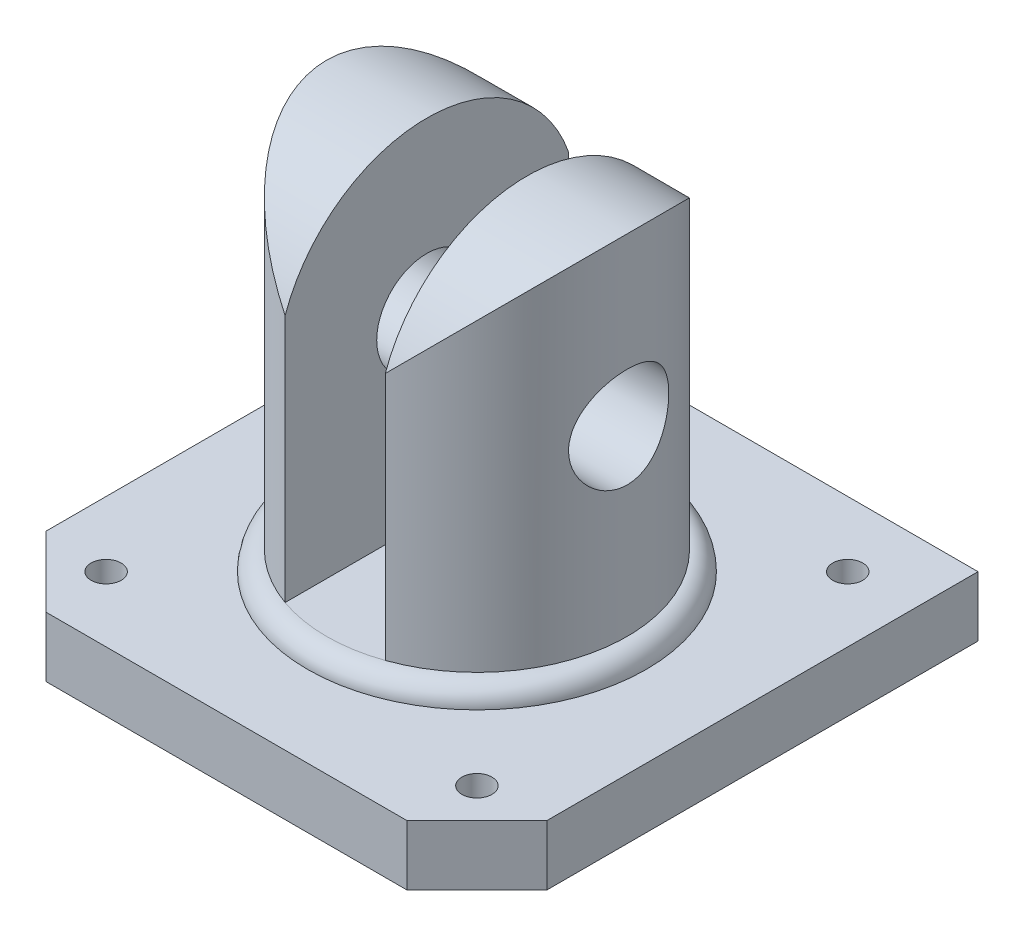
ISO-10303-21;
HEADER;
FILE_DESCRIPTION(('STEP AP214'),'2;1');
FILE_NAME('part.step','',(''),(''),'','','');
FILE_SCHEMA(('AUTOMOTIVE_DESIGN { 1 0 10303 214 1 1 1 1 }'));
ENDSEC;
DATA;
#1=APPLICATION_CONTEXT('core data for automotive mechanical design processes');
#2=APPLICATION_PROTOCOL_DEFINITION('international standard','automotive_design',2000,#1);
#3=PRODUCT_CONTEXT('',#1,'mechanical');
#4=PRODUCT('Part','Part','',(#3));
#5=PRODUCT_RELATED_PRODUCT_CATEGORY('part','',(#4));
#6=PRODUCT_DEFINITION_FORMATION('','',#4);
#7=PRODUCT_DEFINITION_CONTEXT('part definition',#1,'design');
#8=PRODUCT_DEFINITION('design','',#6,#7);
#9=PRODUCT_DEFINITION_SHAPE('','',#8);
#10=(LENGTH_UNIT() NAMED_UNIT(*) SI_UNIT(.MILLI.,.METRE.));
#11=(NAMED_UNIT(*) PLANE_ANGLE_UNIT() SI_UNIT($,.RADIAN.));
#12=(NAMED_UNIT(*) SI_UNIT($,.STERADIAN.) SOLID_ANGLE_UNIT());
#13=UNCERTAINTY_MEASURE_WITH_UNIT(LENGTH_MEASURE(1.E-05),#10,'distance_accuracy_value','');
#14=(GEOMETRIC_REPRESENTATION_CONTEXT(3) GLOBAL_UNCERTAINTY_ASSIGNED_CONTEXT((#13)) GLOBAL_UNIT_ASSIGNED_CONTEXT((#10,
#11,#12)) REPRESENTATION_CONTEXT('',''));
#15=CARTESIAN_POINT('',(0.,0.,0.));
#16=DIRECTION('',(0.,0.,1.));
#17=DIRECTION('',(1.,0.,0.));
#18=AXIS2_PLACEMENT_3D('',#15,#16,#17);
#19=CARTESIAN_POINT('',(25.,6.,-25.));
#20=DIRECTION('',(-1.,0.,0.));
#21=DIRECTION('',(0.,0.,1.));
#22=AXIS2_PLACEMENT_3D('',#19,#20,#21);
#23=PLANE('',#22);
#24=DIRECTION('',(0.,0.,-1.));
#25=VECTOR('',#24,1.);
#26=CARTESIAN_POINT('',(25.,6.,-25.));
#27=LINE('',#26,#25);
#28=CARTESIAN_POINT('',(25.,6.,18.));
#29=VERTEX_POINT('',#28);
#30=CARTESIAN_POINT('',(25.,6.,-25.));
#31=VERTEX_POINT('',#30);
#32=EDGE_CURVE('E170',#29,#31,#27,.T.);
#33=ORIENTED_EDGE('',*,*,#32,.F.);
#34=DIRECTION('',(0.,-1.,0.));
#35=VECTOR('',#34,1.);
#36=CARTESIAN_POINT('',(25.,6.,18.));
#37=LINE('',#36,#35);
#38=CARTESIAN_POINT('',(25.,0.,18.));
#39=VERTEX_POINT('',#38);
#40=EDGE_CURVE('E191',#29,#39,#37,.T.);
#41=ORIENTED_EDGE('',*,*,#40,.T.);
#42=DIRECTION('',(0.,0.,-1.));
#43=VECTOR('',#42,1.);
#44=CARTESIAN_POINT('',(25.,0.,-25.));
#45=LINE('',#44,#43);
#46=CARTESIAN_POINT('',(25.,0.,-25.));
#47=VERTEX_POINT('',#46);
#48=EDGE_CURVE('E169',#39,#47,#45,.T.);
#49=ORIENTED_EDGE('',*,*,#48,.T.);
#50=DIRECTION('',(0.,-1.,0.));
#51=VECTOR('',#50,1.);
#52=CARTESIAN_POINT('',(25.,6.,-25.));
#53=LINE('',#52,#51);
#54=EDGE_CURVE('E188',#31,#47,#53,.T.);
#55=ORIENTED_EDGE('',*,*,#54,.F.);
#56=EDGE_LOOP('',(#33,#41,#49,#55));
#57=FACE_BOUND('',#56,.T.);
#58=ADVANCED_FACE('F44',(#57),#23,.F.);
#59=CARTESIAN_POINT('',(-25.,6.,-25.));
#60=DIRECTION('',(0.,0.,1.));
#61=DIRECTION('',(1.,0.,0.));
#62=AXIS2_PLACEMENT_3D('',#59,#60,#61);
#63=PLANE('',#62);
#64=DIRECTION('',(-1.,0.,0.));
#65=VECTOR('',#64,1.);
#66=CARTESIAN_POINT('',(-25.,0.,-25.));
#67=LINE('',#66,#65);
#68=CARTESIAN_POINT('',(-25.,0.,-25.));
#69=VERTEX_POINT('',#68);
#70=EDGE_CURVE('E181',#47,#69,#67,.T.);
#71=ORIENTED_EDGE('',*,*,#70,.T.);
#72=DIRECTION('',(0.,-1.,0.));
#73=VECTOR('',#72,1.);
#74=CARTESIAN_POINT('',(-25.,6.,-25.));
#75=LINE('',#74,#73);
#76=CARTESIAN_POINT('',(-25.,6.,-25.));
#77=VERTEX_POINT('',#76);
#78=EDGE_CURVE('E179',#77,#69,#75,.T.);
#79=ORIENTED_EDGE('',*,*,#78,.F.);
#80=DIRECTION('',(-1.,0.,0.));
#81=VECTOR('',#80,1.);
#82=CARTESIAN_POINT('',(-25.,6.,-25.));
#83=LINE('',#82,#81);
#84=EDGE_CURVE('E172',#31,#77,#83,.T.);
#85=ORIENTED_EDGE('',*,*,#84,.F.);
#86=ORIENTED_EDGE('',*,*,#54,.T.);
#87=EDGE_LOOP('',(#71,#79,#85,#86));
#88=FACE_BOUND('',#87,.T.);
#89=ADVANCED_FACE('F246',(#88),#63,.F.);
#90=CARTESIAN_POINT('',(-25.,6.,-25.));
#91=DIRECTION('',(1.,0.,0.));
#92=DIRECTION('',(0.,0.,-1.));
#93=AXIS2_PLACEMENT_3D('',#90,#91,#92);
#94=PLANE('',#93);
#95=DIRECTION('',(0.,0.,1.));
#96=VECTOR('',#95,1.);
#97=CARTESIAN_POINT('',(-25.,0.,-25.));
#98=LINE('',#97,#96);
#99=CARTESIAN_POINT('',(-25.,0.,18.));
#100=VERTEX_POINT('',#99);
#101=EDGE_CURVE('E183',#69,#100,#98,.T.);
#102=ORIENTED_EDGE('',*,*,#101,.T.);
#103=DIRECTION('',(0.,1.,0.));
#104=VECTOR('',#103,1.);
#105=CARTESIAN_POINT('',(-25.,6.,18.));
#106=LINE('',#105,#104);
#107=CARTESIAN_POINT('',(-25.,6.,18.));
#108=VERTEX_POINT('',#107);
#109=EDGE_CURVE('E53',#100,#108,#106,.T.);
#110=ORIENTED_EDGE('',*,*,#109,.T.);
#111=DIRECTION('',(0.,0.,1.));
#112=VECTOR('',#111,1.);
#113=CARTESIAN_POINT('',(-25.,6.,-25.));
#114=LINE('',#113,#112);
#115=EDGE_CURVE('E175',#77,#108,#114,.T.);
#116=ORIENTED_EDGE('',*,*,#115,.F.);
#117=ORIENTED_EDGE('',*,*,#78,.T.);
#118=EDGE_LOOP('',(#102,#110,#116,#117));
#119=FACE_BOUND('',#118,.T.);
#120=ADVANCED_FACE('F261',(#119),#94,.F.);
#121=CARTESIAN_POINT('',(-25.,6.,25.));
#122=DIRECTION('',(0.,0.,-1.));
#123=DIRECTION('',(-1.,0.,0.));
#124=AXIS2_PLACEMENT_3D('',#121,#122,#123);
#125=PLANE('',#124);
#126=DIRECTION('',(1.,0.,0.));
#127=VECTOR('',#126,1.);
#128=CARTESIAN_POINT('',(-25.,6.,25.));
#129=LINE('',#128,#127);
#130=CARTESIAN_POINT('',(-18.,6.,25.));
#131=VERTEX_POINT('',#130);
#132=CARTESIAN_POINT('',(18.,6.,25.));
#133=VERTEX_POINT('',#132);
#134=EDGE_CURVE('E177',#131,#133,#129,.T.);
#135=ORIENTED_EDGE('',*,*,#134,.F.);
#136=DIRECTION('',(0.,-1.,0.));
#137=VECTOR('',#136,1.);
#138=CARTESIAN_POINT('',(-18.,6.,25.));
#139=LINE('',#138,#137);
#140=CARTESIAN_POINT('',(-18.,0.,25.));
#141=VERTEX_POINT('',#140);
#142=EDGE_CURVE('E209',#131,#141,#139,.T.);
#143=ORIENTED_EDGE('',*,*,#142,.T.);
#144=DIRECTION('',(1.,0.,0.));
#145=VECTOR('',#144,1.);
#146=CARTESIAN_POINT('',(-25.,0.,25.));
#147=LINE('',#146,#145);
#148=CARTESIAN_POINT('',(18.,0.,25.));
#149=VERTEX_POINT('',#148);
#150=EDGE_CURVE('E173',#141,#149,#147,.T.);
#151=ORIENTED_EDGE('',*,*,#150,.T.);
#152=DIRECTION('',(0.,1.,0.));
#153=VECTOR('',#152,1.);
#154=CARTESIAN_POINT('',(18.,6.,25.));
#155=LINE('',#154,#153);
#156=EDGE_CURVE('E197',#149,#133,#155,.T.);
#157=ORIENTED_EDGE('',*,*,#156,.T.);
#158=EDGE_LOOP('',(#135,#143,#151,#157));
#159=FACE_BOUND('',#158,.T.);
#160=ADVANCED_FACE('F228',(#159),#125,.F.);
#161=CARTESIAN_POINT('',(0.,6.,0.));
#162=DIRECTION('',(0.,1.,0.));
#163=DIRECTION('',(0.,0.,1.));
#164=AXIS2_PLACEMENT_3D('',#161,#162,#163);
#165=PLANE('',#164);
#166=CARTESIAN_POINT('',(-18.5,6.,18.5));
#167=DIRECTION('',(0.,1.,0.));
#168=DIRECTION('',(0.,0.,1.));
#169=AXIS2_PLACEMENT_3D('',#166,#167,#168);
#170=CIRCLE('',#169,1.5);
#171=CARTESIAN_POINT('',(-18.5,6.,20.));
#172=VERTEX_POINT('',#171);
#173=EDGE_CURVE('E505',#172,#172,#170,.T.);
#174=ORIENTED_EDGE('',*,*,#173,.F.);
#175=EDGE_LOOP('',(#174));
#176=FACE_BOUND('',#175,.T.);
#177=CARTESIAN_POINT('',(18.5,6.,18.5));
#178=DIRECTION('',(0.,1.,0.));
#179=DIRECTION('',(0.,0.,1.));
#180=AXIS2_PLACEMENT_3D('',#177,#178,#179);
#181=CIRCLE('',#180,1.5);
#182=CARTESIAN_POINT('',(18.5,6.,20.));
#183=VERTEX_POINT('',#182);
#184=EDGE_CURVE('E508',#183,#183,#181,.T.);
#185=ORIENTED_EDGE('',*,*,#184,.F.);
#186=EDGE_LOOP('',(#185));
#187=FACE_BOUND('',#186,.T.);
#188=CARTESIAN_POINT('',(18.5,6.,-18.5));
#189=DIRECTION('',(0.,1.,0.));
#190=DIRECTION('',(0.,0.,1.));
#191=AXIS2_PLACEMENT_3D('',#188,#189,#190);
#192=CIRCLE('',#191,1.5);
#193=CARTESIAN_POINT('',(18.5,6.,-17.));
#194=VERTEX_POINT('',#193);
#195=EDGE_CURVE('E504',#194,#194,#192,.T.);
#196=ORIENTED_EDGE('',*,*,#195,.F.);
#197=EDGE_LOOP('',(#196));
#198=FACE_BOUND('',#197,.T.);
#199=CARTESIAN_POINT('',(-18.5,6.,-18.5));
#200=DIRECTION('',(0.,1.,0.));
#201=DIRECTION('',(0.,0.,1.));
#202=AXIS2_PLACEMENT_3D('',#199,#200,#201);
#203=CIRCLE('',#202,1.5);
#204=CARTESIAN_POINT('',(-18.5,6.,-17.));
#205=VERTEX_POINT('',#204);
#206=EDGE_CURVE('E214',#205,#205,#203,.T.);
#207=ORIENTED_EDGE('',*,*,#206,.F.);
#208=EDGE_LOOP('',(#207));
#209=FACE_BOUND('',#208,.T.);
#210=CARTESIAN_POINT('',(0.,6.,0.));
#211=DIRECTION('',(0.,1.,0.));
#212=DIRECTION('',(0.,0.,1.));
#213=AXIS2_PLACEMENT_3D('',#210,#211,#212);
#214=CIRCLE('',#213,16.9);
#215=CARTESIAN_POINT('',(0.,6.,16.9));
#216=VERTEX_POINT('',#215);
#217=EDGE_CURVE('E203',#216,#216,#214,.T.);
#218=ORIENTED_EDGE('',*,*,#217,.F.);
#219=EDGE_LOOP('',(#218));
#220=FACE_BOUND('',#219,.T.);
#221=ORIENTED_EDGE('',*,*,#115,.T.);
#222=DIRECTION('',(-0.707106781186546,0.,-0.707106781186549));
#223=VECTOR('',#222,1.);
#224=CARTESIAN_POINT('',(-21.5,6.,21.5));
#225=LINE('',#224,#223);
#226=EDGE_CURVE('E11',#108,#131,#225,.F.);
#227=ORIENTED_EDGE('',*,*,#226,.T.);
#228=ORIENTED_EDGE('',*,*,#134,.T.);
#229=DIRECTION('',(-0.707106781186549,0.,0.707106781186546));
#230=VECTOR('',#229,1.);
#231=CARTESIAN_POINT('',(21.5,6.,21.5000000000001));
#232=LINE('',#231,#230);
#233=EDGE_CURVE('E200',#133,#29,#232,.F.);
#234=ORIENTED_EDGE('',*,*,#233,.T.);
#235=ORIENTED_EDGE('',*,*,#32,.T.);
#236=ORIENTED_EDGE('',*,*,#84,.T.);
#237=EDGE_LOOP('',(#221,#227,#228,#234,#235,#236));
#238=FACE_BOUND('',#237,.T.);
#239=ADVANCED_FACE('F241',(#176,#187,#198,#209,#220,#238),#165,.T.);
#240=CARTESIAN_POINT('',(0.,0.,0.));
#241=DIRECTION('',(0.,1.,0.));
#242=DIRECTION('',(0.,0.,1.));
#243=AXIS2_PLACEMENT_3D('',#240,#241,#242);
#244=PLANE('',#243);
#245=CARTESIAN_POINT('',(-18.5,0.,18.5));
#246=DIRECTION('',(0.,1.,0.));
#247=DIRECTION('',(0.,0.,1.));
#248=AXIS2_PLACEMENT_3D('',#245,#246,#247);
#249=CIRCLE('',#248,1.5);
#250=CARTESIAN_POINT('',(-18.5,0.,20.));
#251=VERTEX_POINT('',#250);
#252=EDGE_CURVE('E220',#251,#251,#249,.T.);
#253=ORIENTED_EDGE('',*,*,#252,.T.);
#254=EDGE_LOOP('',(#253));
#255=FACE_BOUND('',#254,.T.);
#256=CARTESIAN_POINT('',(18.5,0.,18.5));
#257=DIRECTION('',(0.,1.,0.));
#258=DIRECTION('',(0.,0.,1.));
#259=AXIS2_PLACEMENT_3D('',#256,#257,#258);
#260=CIRCLE('',#259,1.5);
#261=CARTESIAN_POINT('',(18.5,0.,20.));
#262=VERTEX_POINT('',#261);
#263=EDGE_CURVE('E217',#262,#262,#260,.T.);
#264=ORIENTED_EDGE('',*,*,#263,.T.);
#265=EDGE_LOOP('',(#264));
#266=FACE_BOUND('',#265,.T.);
#267=CARTESIAN_POINT('',(18.5,0.,-18.5));
#268=DIRECTION('',(0.,1.,0.));
#269=DIRECTION('',(0.,0.,1.));
#270=AXIS2_PLACEMENT_3D('',#267,#268,#269);
#271=CIRCLE('',#270,1.5);
#272=CARTESIAN_POINT('',(18.5,0.,-17.));
#273=VERTEX_POINT('',#272);
#274=EDGE_CURVE('E213',#273,#273,#271,.T.);
#275=ORIENTED_EDGE('',*,*,#274,.T.);
#276=EDGE_LOOP('',(#275));
#277=FACE_BOUND('',#276,.T.);
#278=CARTESIAN_POINT('',(-18.5,0.,-18.5));
#279=DIRECTION('',(0.,1.,0.));
#280=DIRECTION('',(0.,0.,1.));
#281=AXIS2_PLACEMENT_3D('',#278,#279,#280);
#282=CIRCLE('',#281,1.5);
#283=CARTESIAN_POINT('',(-18.5,0.,-17.));
#284=VERTEX_POINT('',#283);
#285=EDGE_CURVE('E210',#284,#284,#282,.T.);
#286=ORIENTED_EDGE('',*,*,#285,.T.);
#287=EDGE_LOOP('',(#286));
#288=FACE_BOUND('',#287,.T.);
#289=ORIENTED_EDGE('',*,*,#150,.F.);
#290=DIRECTION('',(0.707106781186546,0.,0.707106781186549));
#291=VECTOR('',#290,1.);
#292=CARTESIAN_POINT('',(-18.,0.,25.));
#293=LINE('',#292,#291);
#294=EDGE_CURVE('E67',#141,#100,#293,.F.);
#295=ORIENTED_EDGE('',*,*,#294,.T.);
#296=ORIENTED_EDGE('',*,*,#101,.F.);
#297=ORIENTED_EDGE('',*,*,#70,.F.);
#298=ORIENTED_EDGE('',*,*,#48,.F.);
#299=DIRECTION('',(0.707106781186549,0.,-0.707106781186546));
#300=VECTOR('',#299,1.);
#301=CARTESIAN_POINT('',(25.,0.,18.));
#302=LINE('',#301,#300);
#303=EDGE_CURVE('E194',#39,#149,#302,.F.);
#304=ORIENTED_EDGE('',*,*,#303,.T.);
#305=EDGE_LOOP('',(#289,#295,#296,#297,#298,#304));
#306=FACE_BOUND('',#305,.T.);
#307=ADVANCED_FACE('F231',(#255,#266,#277,#288,#306),#244,.F.);
#308=CARTESIAN_POINT('',(25.,6.,18.));
#309=DIRECTION('',(-0.707106781186546,0.,-0.707106781186549));
#310=DIRECTION('',(0.,-1.,0.));
#311=AXIS2_PLACEMENT_3D('',#308,#309,#310);
#312=PLANE('',#311);
#313=ORIENTED_EDGE('',*,*,#233,.F.);
#314=ORIENTED_EDGE('',*,*,#156,.F.);
#315=ORIENTED_EDGE('',*,*,#303,.F.);
#316=ORIENTED_EDGE('',*,*,#40,.F.);
#317=EDGE_LOOP('',(#313,#314,#315,#316));
#318=FACE_BOUND('',#317,.T.);
#319=ADVANCED_FACE('F238',(#318),#312,.F.);
#320=CARTESIAN_POINT('',(0.,6.,0.));
#321=DIRECTION('',(0.,1.,0.));
#322=DIRECTION('',(0.,0.,1.));
#323=AXIS2_PLACEMENT_3D('',#320,#321,#322);
#324=TOROIDAL_SURFACE('',#323,15.,1.90000000000001);
#325=ORIENTED_EDGE('',*,*,#217,.T.);
#326=EDGE_LOOP('',(#325));
#327=FACE_BOUND('',#326,.T.);
#328=CARTESIAN_POINT('',(0.,7.9,0.));
#329=DIRECTION('',(0.,1.,0.));
#330=DIRECTION('',(0.,0.,1.));
#331=AXIS2_PLACEMENT_3D('',#328,#329,#330);
#332=CIRCLE('',#331,15.);
#333=CARTESIAN_POINT('',(5.,7.90000000000001,14.142135623731));
#334=VERTEX_POINT('',#333);
#335=CARTESIAN_POINT('',(5.,7.9,-14.142135623731));
#336=VERTEX_POINT('',#335);
#337=EDGE_CURVE('E124',#334,#336,#332,.T.);
#338=ORIENTED_EDGE('',*,*,#337,.F.);
#339=CARTESIAN_POINT('',(0.,7.9,0.));
#340=DIRECTION('',(0.,1.,0.));
#341=DIRECTION('',(-1.,0.,0.));
#342=AXIS2_PLACEMENT_3D('',#339,#340,#341);
#343=CIRCLE('',#342,15.);
#344=CARTESIAN_POINT('',(-5.,7.9,14.142135623731));
#345=VERTEX_POINT('',#344);
#346=EDGE_CURVE('E133',#345,#334,#343,.T.);
#347=ORIENTED_EDGE('',*,*,#346,.F.);
#348=CARTESIAN_POINT('',(-5.,7.9,-14.142135623731));
#349=VERTEX_POINT('',#348);
#350=EDGE_CURVE('E127',#349,#345,#332,.T.);
#351=ORIENTED_EDGE('',*,*,#350,.F.);
#352=EDGE_CURVE('E121',#336,#349,#343,.T.);
#353=ORIENTED_EDGE('',*,*,#352,.F.);
#354=EDGE_LOOP('',(#338,#347,#351,#353));
#355=FACE_BOUND('',#354,.T.);
#356=ADVANCED_FACE('F123',(#327,#355),#324,.T.);
#357=CARTESIAN_POINT('',(36.7,27.7,0.));
#358=DIRECTION('',(-1.,0.,0.));
#359=DIRECTION('',(0.,0.,1.));
#360=AXIS2_PLACEMENT_3D('',#357,#358,#359);
#361=CYLINDRICAL_SURFACE('',#360,15.);
#362=CARTESIAN_POINT('',(-5.,27.7,0.));
#363=DIRECTION('',(1.,0.,0.));
#364=DIRECTION('',(0.,1.,0.));
#365=AXIS2_PLACEMENT_3D('',#362,#363,#364);
#366=CIRCLE('',#365,15.);
#367=CARTESIAN_POINT('',(-5.,32.7,-14.142135623731));
#368=VERTEX_POINT('',#367);
#369=CARTESIAN_POINT('',(-5.,32.7,14.142135623731));
#370=VERTEX_POINT('',#369);
#371=EDGE_CURVE('E159',#368,#370,#366,.T.);
#372=ORIENTED_EDGE('',*,*,#371,.F.);
#373=CARTESIAN_POINT('',(0.,27.7,0.));
#374=DIRECTION('',(-0.707106781186547,-0.707106781186547,0.));
#375=DIRECTION('',(0.707106781186547,-0.707106781186547,0.));
#376=AXIS2_PLACEMENT_3D('',#373,#374,#375);
#377=ELLIPSE('',#376,21.2132034355964,15.);
#378=EDGE_CURVE('E156',#368,#370,#377,.F.);
#379=ORIENTED_EDGE('',*,*,#378,.T.);
#380=EDGE_LOOP('',(#372,#379));
#381=FACE_BOUND('',#380,.T.);
#382=ADVANCED_FACE('F272',(#381),#361,.T.);
#383=CARTESIAN_POINT('',(36.7,26.,0.));
#384=DIRECTION('',(-1.,0.,0.));
#385=DIRECTION('',(0.,0.,1.));
#386=AXIS2_PLACEMENT_3D('',#383,#384,#385);
#387=CYLINDRICAL_SURFACE('',#386,5.);
#388=CARTESIAN_POINT('',(-5.,26.,0.));
#389=DIRECTION('',(1.,0.,0.));
#390=DIRECTION('',(0.,1.,0.));
#391=AXIS2_PLACEMENT_3D('',#388,#389,#390);
#392=CIRCLE('',#391,5.);
#393=CARTESIAN_POINT('',(-5.,31.,0.));
#394=VERTEX_POINT('',#393);
#395=EDGE_CURVE('E206',#394,#394,#392,.F.);
#396=ORIENTED_EDGE('',*,*,#395,.F.);
#397=EDGE_LOOP('',(#396));
#398=FACE_BOUND('',#397,.T.);
#399=CARTESIAN_POINT('',(-14.142135623731,26.,5.));
#400=CARTESIAN_POINT('',(-14.1421347265217,26.2723408741804,5.00000128973857));
#401=CARTESIAN_POINT('',(-14.1500884645429,26.544673999118,4.97767391842761));
#402=CARTESIAN_POINT('',(-14.1808787040627,27.0812721049712,4.88925565844404));
#403=CARTESIAN_POINT('',(-14.2037176571094,27.3455357493623,4.82315756084199));
#404=CARTESIAN_POINT('',(-14.2614101844396,27.8581344649864,4.64977742842453));
#405=CARTESIAN_POINT('',(-14.2962401985661,28.1064996472136,4.54257610701623));
#406=CARTESIAN_POINT('',(-14.3739561005162,28.5818002427398,4.29030814220691));
#407=CARTESIAN_POINT('',(-14.4168437651806,28.8087309127682,4.14523314430092));
#408=CARTESIAN_POINT('',(-14.5077244703737,29.2435998116916,3.81525573221439));
#409=CARTESIAN_POINT('',(-14.5558447422322,29.4505771433586,3.6291217068896));
#410=CARTESIAN_POINT('',(-14.6506932400501,29.8310340061232,3.22493833607198));
#411=CARTESIAN_POINT('',(-14.6974212414481,30.0045081579118,3.00688387526188));
#412=CARTESIAN_POINT('',(-14.7856933460899,30.317394486648,2.53802253982505));
#413=CARTESIAN_POINT('',(-14.8270703850803,30.4557998530898,2.28650955612263));
#414=CARTESIAN_POINT('',(-14.8984793385491,30.6879579256375,1.76215611493737));
#415=CARTESIAN_POINT('',(-14.9285143101501,30.7817226658845,1.48932142843606));
#416=CARTESIAN_POINT('',(-14.9729537715953,30.918679273162,0.940144087167474));
#417=CARTESIAN_POINT('',(-14.987865738878,30.963517231285,0.664253774264845));
#418=CARTESIAN_POINT('',(-15.0021804109124,31.0065814668033,0.10848937412045));
#419=CARTESIAN_POINT('',(-15.0015871131448,31.0048197582621,-0.171383667719479));
#420=CARTESIAN_POINT('',(-14.9853019809366,30.9557787271699,-0.715517575969071));
#421=CARTESIAN_POINT('',(-14.9702032377559,30.9102873576276,-0.979960242958281));
#422=CARTESIAN_POINT('',(-14.9273483669866,30.7780350950976,-1.49721719411086));
#423=CARTESIAN_POINT('',(-14.8995913815591,30.6912714051009,-1.75003068889608));
#424=CARTESIAN_POINT('',(-14.8337835146612,30.4778934134697,-2.24076237420986));
#425=CARTESIAN_POINT('',(-14.7956021262008,30.3507703072674,-2.47844110484422));
#426=CARTESIAN_POINT('',(-14.712919651946,30.0607014727567,-2.92962162763661));
#427=CARTESIAN_POINT('',(-14.6684168100733,29.8977457833619,-3.1431166719267));
#428=CARTESIAN_POINT('',(-14.5753095924948,29.5316280327015,-3.55050433275654));
#429=CARTESIAN_POINT('',(-14.5266107584439,29.3269342107926,-3.74300078532636));
#430=CARTESIAN_POINT('',(-14.432366762445,28.8877563713669,-4.09138629799087));
#431=CARTESIAN_POINT('',(-14.3868220872808,28.6532677713598,-4.24726971640772));
#432=CARTESIAN_POINT('',(-14.3035262560556,28.1567318719828,-4.51993727517872));
#433=CARTESIAN_POINT('',(-14.2658954642374,27.8943393434111,-4.6361323181067));
#434=CARTESIAN_POINT('',(-14.2040825412192,27.3521430289279,-4.82221596634668));
#435=CARTESIAN_POINT('',(-14.1798947743546,27.0723465939688,-4.89212397873747));
#436=CARTESIAN_POINT('',(-14.1489818157793,26.5168082229421,-4.98080641048761));
#437=CARTESIAN_POINT('',(-14.1415180159378,26.2414528762567,-5.00174547753817));
#438=CARTESIAN_POINT('',(-14.1428336029592,25.6911192544295,-4.9980271945486));
#439=CARTESIAN_POINT('',(-14.1516100395907,25.4161409198801,-4.97337812613382));
#440=CARTESIAN_POINT('',(-14.183680904515,24.8842151714404,-4.88112825776155));
#441=CARTESIAN_POINT('',(-14.206466272042,24.6269728492458,-4.81503196990342));
#442=CARTESIAN_POINT('',(-14.2634276835511,24.1272819688041,-4.64356931280234));
#443=CARTESIAN_POINT('',(-14.297605746742,23.8848360420461,-4.53819598181711));
#444=CARTESIAN_POINT('',(-14.3748438797893,23.413097895765,-4.28737170369469));
#445=CARTESIAN_POINT('',(-14.4181512832814,23.184466786791,-4.14075559179248));
#446=CARTESIAN_POINT('',(-14.5082884365483,22.7542697380814,-3.81292815278779));
#447=CARTESIAN_POINT('',(-14.5551192221897,22.5527118066939,-3.63170662749391));
#448=CARTESIAN_POINT('',(-14.6497519318925,22.1723600795468,-3.22945852950163));
#449=CARTESIAN_POINT('',(-14.6974921788948,21.9951280499057,-3.00693635273326));
#450=CARTESIAN_POINT('',(-14.7863425806554,21.6804192882598,-2.53413645700129));
#451=CARTESIAN_POINT('',(-14.8274529708847,21.5429411441879,-2.28385972432276));
#452=CARTESIAN_POINT('',(-14.8982202905301,21.3128994756914,-1.76389931216148));
#453=CARTESIAN_POINT('',(-14.9279515002266,21.2200436142597,-1.49435561660598));
#454=CARTESIAN_POINT('',(-14.9729305418887,21.0813612896995,-0.942292329230083));
#455=CARTESIAN_POINT('',(-14.9881836017009,21.0355178505975,-0.659777459769449));
#456=CARTESIAN_POINT('',(-15.0020931618128,20.9936896119718,-0.104076679300208));
#457=CARTESIAN_POINT('',(-15.001496004472,20.9954627303381,0.168923619600089));
#458=CARTESIAN_POINT('',(-14.9856098259699,21.043286540732,0.710555725000866));
#459=CARTESIAN_POINT('',(-14.9703219966788,21.0893336407638,0.979187884095282));
#460=CARTESIAN_POINT('',(-14.9270457477206,21.2229111728798,1.50021059716029));
#461=CARTESIAN_POINT('',(-14.8992629180574,21.3097710767647,1.75279135456395));
#462=CARTESIAN_POINT('',(-14.8338580352247,21.5218876554858,2.23989175469898));
#463=CARTESIAN_POINT('',(-14.7962342024008,21.6471512759851,2.47440812071216));
#464=CARTESIAN_POINT('',(-14.713293441394,21.93784756051,2.92817008154393));
#465=CARTESIAN_POINT('',(-14.6677436245963,22.1045934269082,3.14653125778804));
#466=CARTESIAN_POINT('',(-14.574649439594,22.471286955781,3.55290513136214));
#467=CARTESIAN_POINT('',(-14.5271044386549,22.6712452113136,3.74090810812296));
#468=CARTESIAN_POINT('',(-14.4331639912799,23.1080467779347,4.08870904416559));
#469=CARTESIAN_POINT('',(-14.3868863994315,23.3460275548832,4.2471148299895));
#470=CARTESIAN_POINT('',(-14.3030096661508,23.8466721345139,4.52157171650557));
#471=CARTESIAN_POINT('',(-14.2654082580625,24.1093294651483,4.63763388409737));
#472=CARTESIAN_POINT('',(-14.2050667103257,24.6398091200782,4.81921914102083));
#473=CARTESIAN_POINT('',(-14.1817316428591,24.9068613176268,4.8867895457476));
#474=CARTESIAN_POINT('',(-14.1502691769759,25.4492802523335,4.97717160074634));
#475=CARTESIAN_POINT('',(-14.1421365308731,25.7246440870535,4.99999869598296));
#476=CARTESIAN_POINT('',(-14.142135623731,26.,5.));
#477=B_SPLINE_CURVE_WITH_KNOTS('',3,(#399,#400,#401,#402,#403,#404,#405,#406,#407,#408,#409,
#410,#411,#412,#413,#414,#415,#416,#417,#418,#419,#420,#421,#422,#423,#424,#425,#426,#427,#428,
#429,#430,#431,#432,#433,#434,#435,#436,#437,#438,#439,#440,#441,#442,#443,#444,#445,#446,#447,
#448,#449,#450,#451,#452,#453,#454,#455,#456,#457,#458,#459,#460,#461,#462,#463,#464,#465,#466,
#467,#468,#469,#470,#471,#472,#473,#474,#475,#476),.UNSPECIFIED.,.T.,.F.,(4,2,2,2,2,2,2,2,2,2,2,
2,2,2,2,2,2,2,2,2,2,2,2,2,2,2,2,2,2,2,2,2,2,2,2,2,2,2,4),(0.,0.816002923996784,1.63214027507582,
2.44668313750414,3.26140583092721,4.1050668713784,4.9488632585994,5.81467530718286,
6.68025381933945,7.51571593824671,8.35096266511636,9.15345024127845,9.95599220946183,
10.7690827430167,11.5823995937011,12.4340087181959,13.2857489806053,14.1496319921528,
15.0131525678308,15.837714568222,16.6621267918617,17.4582197884388,18.2544539573473,
19.0759428867857,19.8976742831064,20.7589404085546,21.6201759378766,22.4756895595426,
23.3308941502078,24.1459042338818,24.9608482004891,25.7628478020215,26.5649925381621,
27.3967759760317,28.2288252216316,29.0934451368072,29.9578389133433,30.7831606081345,
31.6081973595232),.UNSPECIFIED.);
#478=CARTESIAN_POINT('',(-14.142135623731,26.,5.));
#479=VERTEX_POINT('',#478);
#480=EDGE_CURVE('E475',#479,#479,#477,.T.);
#481=ORIENTED_EDGE('',*,*,#480,.T.);
#482=EDGE_LOOP('',(#481));
#483=FACE_BOUND('',#482,.T.);
#484=ADVANCED_FACE('F320',(#398,#483),#387,.F.);
#485=CARTESIAN_POINT('',(5.,26.,0.));
#486=DIRECTION('',(-1.,0.,0.));
#487=DIRECTION('',(0.,-1.,0.));
#488=AXIS2_PLACEMENT_3D('',#485,#486,#487);
#489=CIRCLE('',#488,5.);
#490=CARTESIAN_POINT('',(5.,21.,0.));
#491=VERTEX_POINT('',#490);
#492=EDGE_CURVE('E145',#491,#491,#489,.F.);
#493=ORIENTED_EDGE('',*,*,#492,.F.);
#494=EDGE_LOOP('',(#493));
#495=FACE_BOUND('',#494,.T.);
#496=CARTESIAN_POINT('',(14.142135623731,26.,5.));
#497=CARTESIAN_POINT('',(14.1421347265217,25.7276591258196,5.00000128973857));
#498=CARTESIAN_POINT('',(14.1500884645429,25.455326000882,4.97767391842761));
#499=CARTESIAN_POINT('',(14.1808787040627,24.9187278950288,4.88925565844404));
#500=CARTESIAN_POINT('',(14.2037176571094,24.6544642506377,4.82315756084199));
#501=CARTESIAN_POINT('',(14.2614101844396,24.1418655350136,4.64977742842453));
#502=CARTESIAN_POINT('',(14.2962401985661,23.8935003527864,4.54257610701623));
#503=CARTESIAN_POINT('',(14.3739561005162,23.4181997572602,4.29030814220691));
#504=CARTESIAN_POINT('',(14.4168437651806,23.1912690872318,4.14523314430092));
#505=CARTESIAN_POINT('',(14.5077244703737,22.7564001883084,3.81525573221439));
#506=CARTESIAN_POINT('',(14.5558447422322,22.5494228566414,3.6291217068896));
#507=CARTESIAN_POINT('',(14.6506932400501,22.1689659938768,3.22493833607197));
#508=CARTESIAN_POINT('',(14.6974212414481,21.9954918420881,3.00688387526188));
#509=CARTESIAN_POINT('',(14.7856933460899,21.682605513352,2.53802253982505));
#510=CARTESIAN_POINT('',(14.8270703850803,21.5442001469102,2.28650955612263));
#511=CARTESIAN_POINT('',(14.8984793385491,21.3120420743624,1.76215611493737));
#512=CARTESIAN_POINT('',(14.9285143101501,21.2182773341155,1.48932142843606));
#513=CARTESIAN_POINT('',(14.9729537715953,21.081320726838,0.940144087167474));
#514=CARTESIAN_POINT('',(14.987865738878,21.036482768715,0.664253774264845));
#515=CARTESIAN_POINT('',(15.0021804109124,20.9934185331967,0.10848937412045));
#516=CARTESIAN_POINT('',(15.0015871131448,20.9951802417379,-0.171383667719479));
#517=CARTESIAN_POINT('',(14.9853019809366,21.0442212728301,-0.715517575969071));
#518=CARTESIAN_POINT('',(14.9702032377559,21.0897126423724,-0.979960242958281));
#519=CARTESIAN_POINT('',(14.9273483669866,21.2219649049024,-1.49721719411086));
#520=CARTESIAN_POINT('',(14.8995913815591,21.3087285948991,-1.75003068889608));
#521=CARTESIAN_POINT('',(14.8337835146612,21.5221065865303,-2.24076237420986));
#522=CARTESIAN_POINT('',(14.7956021262008,21.6492296927326,-2.47844110484422));
#523=CARTESIAN_POINT('',(14.712919651946,21.9392985272433,-2.92962162763661));
#524=CARTESIAN_POINT('',(14.6684168100733,22.1022542166381,-3.1431166719267));
#525=CARTESIAN_POINT('',(14.5753095924948,22.4683719672985,-3.55050433275654));
#526=CARTESIAN_POINT('',(14.5266107584439,22.6730657892074,-3.74300078532636));
#527=CARTESIAN_POINT('',(14.432366762445,23.1122436286331,-4.09138629799087));
#528=CARTESIAN_POINT('',(14.3868220872808,23.3467322286402,-4.24726971640772));
#529=CARTESIAN_POINT('',(14.3035262560556,23.8432681280172,-4.51993727517872));
#530=CARTESIAN_POINT('',(14.2658954642374,24.1056606565889,-4.6361323181067));
#531=CARTESIAN_POINT('',(14.2040825412192,24.6478569710721,-4.82221596634668));
#532=CARTESIAN_POINT('',(14.1798947743546,24.9276534060312,-4.89212397873747));
#533=CARTESIAN_POINT('',(14.1489818157793,25.4831917770579,-4.98080641048761));
#534=CARTESIAN_POINT('',(14.1415180159378,25.7585471237433,-5.00174547753817));
#535=CARTESIAN_POINT('',(14.1428336029592,26.3088807455705,-4.9980271945486));
#536=CARTESIAN_POINT('',(14.1516100395907,26.5838590801199,-4.97337812613382));
#537=CARTESIAN_POINT('',(14.183680904515,27.1157848285595,-4.88112825776155));
#538=CARTESIAN_POINT('',(14.206466272042,27.3730271507542,-4.81503196990342));
#539=CARTESIAN_POINT('',(14.2634276835511,27.8727180311959,-4.64356931280234));
#540=CARTESIAN_POINT('',(14.297605746742,28.1151639579539,-4.53819598181711));
#541=CARTESIAN_POINT('',(14.3748438797893,28.586902104235,-4.28737170369469));
#542=CARTESIAN_POINT('',(14.4181512832814,28.815533213209,-4.14075559179248));
#543=CARTESIAN_POINT('',(14.5082884365483,29.2457302619186,-3.81292815278779));
#544=CARTESIAN_POINT('',(14.5551192221897,29.4472881933061,-3.63170662749391));
#545=CARTESIAN_POINT('',(14.6497519318925,29.8276399204532,-3.22945852950163));
#546=CARTESIAN_POINT('',(14.6974921788948,30.0048719500942,-3.00693635273326));
#547=CARTESIAN_POINT('',(14.7863425806554,30.3195807117402,-2.53413645700129));
#548=CARTESIAN_POINT('',(14.8274529708847,30.4570588558121,-2.28385972432276));
#549=CARTESIAN_POINT('',(14.8982202905301,30.6871005243086,-1.76389931216148));
#550=CARTESIAN_POINT('',(14.9279515002266,30.7799563857403,-1.49435561660598));
#551=CARTESIAN_POINT('',(14.9729305418887,30.9186387103005,-0.942292329230083));
#552=CARTESIAN_POINT('',(14.9881836017009,30.9644821494025,-0.659777459769449));
#553=CARTESIAN_POINT('',(15.0020931618128,31.0063103880282,-0.104076679300208));
#554=CARTESIAN_POINT('',(15.001496004472,31.0045372696619,0.168923619600089));
#555=CARTESIAN_POINT('',(14.9856098259699,30.956713459268,0.710555725000866));
#556=CARTESIAN_POINT('',(14.9703219966788,30.9106663592362,0.979187884095281));
#557=CARTESIAN_POINT('',(14.9270457477206,30.7770888271202,1.50021059716029));
#558=CARTESIAN_POINT('',(14.8992629180574,30.6902289232353,1.75279135456395));
#559=CARTESIAN_POINT('',(14.8338580352247,30.4781123445142,2.23989175469898));
#560=CARTESIAN_POINT('',(14.7962342024008,30.3528487240149,2.47440812071216));
#561=CARTESIAN_POINT('',(14.713293441394,30.06215243949,2.92817008154393));
#562=CARTESIAN_POINT('',(14.6677436245963,29.8954065730918,3.14653125778804));
#563=CARTESIAN_POINT('',(14.574649439594,29.528713044219,3.55290513136214));
#564=CARTESIAN_POINT('',(14.5271044386549,29.3287547886864,3.74090810812296));
#565=CARTESIAN_POINT('',(14.4331639912799,28.8919532220653,4.08870904416559));
#566=CARTESIAN_POINT('',(14.3868863994315,28.6539724451168,4.2471148299895));
#567=CARTESIAN_POINT('',(14.3030096661508,28.1533278654861,4.52157171650558));
#568=CARTESIAN_POINT('',(14.2654082580625,27.8906705348517,4.63763388409737));
#569=CARTESIAN_POINT('',(14.2050667103257,27.3601908799218,4.81921914102083));
#570=CARTESIAN_POINT('',(14.1817316428591,27.0931386823732,4.8867895457476));
#571=CARTESIAN_POINT('',(14.1502691769759,26.5507197476665,4.97717160074634));
#572=CARTESIAN_POINT('',(14.1421365308731,26.2753559129465,4.99999869598296));
#573=CARTESIAN_POINT('',(14.142135623731,26.,5.));
#574=B_SPLINE_CURVE_WITH_KNOTS('',3,(#496,#497,#498,#499,#500,#501,#502,#503,#504,#505,#506,
#507,#508,#509,#510,#511,#512,#513,#514,#515,#516,#517,#518,#519,#520,#521,#522,#523,#524,#525,
#526,#527,#528,#529,#530,#531,#532,#533,#534,#535,#536,#537,#538,#539,#540,#541,#542,#543,#544,
#545,#546,#547,#548,#549,#550,#551,#552,#553,#554,#555,#556,#557,#558,#559,#560,#561,#562,#563,
#564,#565,#566,#567,#568,#569,#570,#571,#572,#573),.UNSPECIFIED.,.T.,.F.,(4,2,2,2,2,2,2,2,2,2,2,
2,2,2,2,2,2,2,2,2,2,2,2,2,2,2,2,2,2,2,2,2,2,2,2,2,2,2,4),(0.,0.816002923996784,1.63214027507582,
2.44668313750414,3.26140583092721,4.10506687137841,4.9488632585994,5.81467530718286,
6.68025381933945,7.51571593824671,8.35096266511636,9.15345024127845,9.95599220946183,
10.7690827430167,11.5823995937011,12.4340087181959,13.2857489806053,14.1496319921528,
15.0131525678308,15.837714568222,16.6621267918617,17.4582197884388,18.2544539573473,
19.0759428867858,19.8976742831064,20.7589404085546,21.6201759378766,22.4756895595426,
23.3308941502078,24.1459042338818,24.9608482004891,25.7628478020215,26.5649925381621,
27.3967759760317,28.2288252216316,29.0934451368072,29.9578389133433,30.7831606081345,
31.6081973595232),.UNSPECIFIED.);
#575=CARTESIAN_POINT('',(14.142135623731,26.,5.));
#576=VERTEX_POINT('',#575);
#577=EDGE_CURVE('E481',#576,#576,#574,.T.);
#578=ORIENTED_EDGE('',*,*,#577,.T.);
#579=EDGE_LOOP('',(#578));
#580=FACE_BOUND('',#579,.T.);
#581=ADVANCED_FACE('F330',(#495,#580),#387,.F.);
#582=CARTESIAN_POINT('',(0.,27.7,0.));
#583=DIRECTION('',(0.707106781186547,-0.707106781186547,0.));
#584=DIRECTION('',(-0.707106781186547,-0.707106781186547,0.));
#585=AXIS2_PLACEMENT_3D('',#582,#583,#584);
#586=ELLIPSE('',#585,21.2132034355964,15.);
#587=CARTESIAN_POINT('',(5.,32.7,14.142135623731));
#588=VERTEX_POINT('',#587);
#589=CARTESIAN_POINT('',(5.,32.7,-14.142135623731));
#590=VERTEX_POINT('',#589);
#591=EDGE_CURVE('E487',#588,#590,#586,.F.);
#592=ORIENTED_EDGE('',*,*,#591,.T.);
#593=CARTESIAN_POINT('',(5.,27.7,0.));
#594=DIRECTION('',(-1.,0.,0.));
#595=DIRECTION('',(0.,-1.,0.));
#596=AXIS2_PLACEMENT_3D('',#593,#594,#595);
#597=CIRCLE('',#596,15.);
#598=EDGE_CURVE('E132',#588,#590,#597,.T.);
#599=ORIENTED_EDGE('',*,*,#598,.F.);
#600=EDGE_LOOP('',(#592,#599));
#601=FACE_BOUND('',#600,.T.);
#602=ADVANCED_FACE('F323',(#601),#361,.T.);
#603=CARTESIAN_POINT('',(0.,42.7,0.));
#604=DIRECTION('',(0.,-1.,0.));
#605=DIRECTION('',(0.,0.,-1.));
#606=AXIS2_PLACEMENT_3D('',#603,#604,#605);
#607=CYLINDRICAL_SURFACE('',#606,15.);
#608=ORIENTED_EDGE('',*,*,#480,.F.);
#609=EDGE_LOOP('',(#608));
#610=FACE_BOUND('',#609,.T.);
#611=DIRECTION('',(0.,-1.,0.));
#612=VECTOR('',#611,1.);
#613=CARTESIAN_POINT('',(-5.,42.7,-14.142135623731));
#614=LINE('',#613,#612);
#615=EDGE_CURVE('E152',#349,#368,#614,.F.);
#616=ORIENTED_EDGE('',*,*,#615,.F.);
#617=ORIENTED_EDGE('',*,*,#350,.T.);
#618=DIRECTION('',(0.,-1.,0.));
#619=VECTOR('',#618,1.);
#620=CARTESIAN_POINT('',(-5.,42.7,14.142135623731));
#621=LINE('',#620,#619);
#622=EDGE_CURVE('E166',#370,#345,#621,.T.);
#623=ORIENTED_EDGE('',*,*,#622,.F.);
#624=ORIENTED_EDGE('',*,*,#378,.F.);
#625=EDGE_LOOP('',(#616,#617,#623,#624));
#626=FACE_BOUND('',#625,.T.);
#627=ADVANCED_FACE('F344',(#610,#626),#607,.T.);
#628=CARTESIAN_POINT('',(-5.,43.628035611369,36.7));
#629=DIRECTION('',(1.,0.,0.));
#630=DIRECTION('',(0.,1.,0.));
#631=AXIS2_PLACEMENT_3D('',#628,#629,#630);
#632=PLANE('',#631);
#633=ORIENTED_EDGE('',*,*,#395,.T.);
#634=EDGE_LOOP('',(#633));
#635=FACE_BOUND('',#634,.T.);
#636=ORIENTED_EDGE('',*,*,#615,.T.);
#637=ORIENTED_EDGE('',*,*,#371,.T.);
#638=ORIENTED_EDGE('',*,*,#622,.T.);
#639=DIRECTION('',(0.,0.,-1.));
#640=VECTOR('',#639,1.);
#641=CARTESIAN_POINT('',(-5.,7.9,36.7));
#642=LINE('',#641,#640);
#643=EDGE_CURVE('E155',#345,#349,#642,.T.);
#644=ORIENTED_EDGE('',*,*,#643,.T.);
#645=EDGE_LOOP('',(#636,#637,#638,#644));
#646=FACE_BOUND('',#645,.T.);
#647=ADVANCED_FACE('F351',(#635,#646),#632,.T.);
#648=DIRECTION('',(0.,-1.,0.));
#649=VECTOR('',#648,1.);
#650=CARTESIAN_POINT('',(5.,42.7,14.142135623731));
#651=LINE('',#650,#649);
#652=EDGE_CURVE('E144',#334,#588,#651,.F.);
#653=ORIENTED_EDGE('',*,*,#652,.F.);
#654=ORIENTED_EDGE('',*,*,#337,.T.);
#655=DIRECTION('',(0.,-1.,0.));
#656=VECTOR('',#655,1.);
#657=CARTESIAN_POINT('',(5.,42.7,-14.142135623731));
#658=LINE('',#657,#656);
#659=EDGE_CURVE('E142',#590,#336,#658,.T.);
#660=ORIENTED_EDGE('',*,*,#659,.F.);
#661=ORIENTED_EDGE('',*,*,#591,.F.);
#662=EDGE_LOOP('',(#653,#654,#660,#661));
#663=FACE_BOUND('',#662,.T.);
#664=ORIENTED_EDGE('',*,*,#577,.F.);
#665=EDGE_LOOP('',(#664));
#666=FACE_BOUND('',#665,.T.);
#667=ADVANCED_FACE('F139',(#663,#666),#607,.T.);
#668=CARTESIAN_POINT('',(5.,43.628035611369,36.7));
#669=DIRECTION('',(-1.,0.,0.));
#670=DIRECTION('',(0.,-1.,0.));
#671=AXIS2_PLACEMENT_3D('',#668,#669,#670);
#672=PLANE('',#671);
#673=ORIENTED_EDGE('',*,*,#492,.T.);
#674=EDGE_LOOP('',(#673));
#675=FACE_BOUND('',#674,.T.);
#676=ORIENTED_EDGE('',*,*,#652,.T.);
#677=ORIENTED_EDGE('',*,*,#598,.T.);
#678=ORIENTED_EDGE('',*,*,#659,.T.);
#679=DIRECTION('',(0.,0.,-1.));
#680=VECTOR('',#679,1.);
#681=CARTESIAN_POINT('',(5.,7.90000000000001,36.7));
#682=LINE('',#681,#680);
#683=EDGE_CURVE('E151',#334,#336,#682,.T.);
#684=ORIENTED_EDGE('',*,*,#683,.F.);
#685=EDGE_LOOP('',(#676,#677,#678,#684));
#686=FACE_BOUND('',#685,.T.);
#687=ADVANCED_FACE('F150',(#675,#686),#672,.T.);
#688=CARTESIAN_POINT('',(-5.,7.9,36.7));
#689=DIRECTION('',(0.,1.,0.));
#690=DIRECTION('',(-1.,0.,0.));
#691=AXIS2_PLACEMENT_3D('',#688,#689,#690);
#692=PLANE('',#691);
#693=ORIENTED_EDGE('',*,*,#346,.T.);
#694=ORIENTED_EDGE('',*,*,#683,.T.);
#695=ORIENTED_EDGE('',*,*,#352,.T.);
#696=ORIENTED_EDGE('',*,*,#643,.F.);
#697=EDGE_LOOP('',(#693,#694,#695,#696));
#698=FACE_BOUND('',#697,.T.);
#699=ADVANCED_FACE('F154',(#698),#692,.T.);
#700=CARTESIAN_POINT('',(-18.5,-3.,-18.5));
#701=DIRECTION('',(0.,1.,0.));
#702=DIRECTION('',(0.,0.,1.));
#703=AXIS2_PLACEMENT_3D('',#700,#701,#702);
#704=CYLINDRICAL_SURFACE('',#703,1.5);
#705=ORIENTED_EDGE('',*,*,#206,.T.);
#706=EDGE_LOOP('',(#705));
#707=FACE_BOUND('',#706,.T.);
#708=ORIENTED_EDGE('',*,*,#285,.F.);
#709=EDGE_LOOP('',(#708));
#710=FACE_BOUND('',#709,.T.);
#711=ADVANCED_FACE('F381',(#707,#710),#704,.F.);
#712=CARTESIAN_POINT('',(18.5,-3.,-18.5));
#713=DIRECTION('',(0.,1.,0.));
#714=DIRECTION('',(0.,0.,1.));
#715=AXIS2_PLACEMENT_3D('',#712,#713,#714);
#716=CYLINDRICAL_SURFACE('',#715,1.5);
#717=ORIENTED_EDGE('',*,*,#195,.T.);
#718=EDGE_LOOP('',(#717));
#719=FACE_BOUND('',#718,.T.);
#720=ORIENTED_EDGE('',*,*,#274,.F.);
#721=EDGE_LOOP('',(#720));
#722=FACE_BOUND('',#721,.T.);
#723=ADVANCED_FACE('F389',(#719,#722),#716,.F.);
#724=CARTESIAN_POINT('',(18.5,-3.,18.5));
#725=DIRECTION('',(0.,1.,0.));
#726=DIRECTION('',(0.,0.,1.));
#727=AXIS2_PLACEMENT_3D('',#724,#725,#726);
#728=CYLINDRICAL_SURFACE('',#727,1.5);
#729=ORIENTED_EDGE('',*,*,#184,.T.);
#730=EDGE_LOOP('',(#729));
#731=FACE_BOUND('',#730,.T.);
#732=ORIENTED_EDGE('',*,*,#263,.F.);
#733=EDGE_LOOP('',(#732));
#734=FACE_BOUND('',#733,.T.);
#735=ADVANCED_FACE('F253',(#731,#734),#728,.F.);
#736=CARTESIAN_POINT('',(-18.5,-3.,18.5));
#737=DIRECTION('',(0.,1.,0.));
#738=DIRECTION('',(0.,0.,1.));
#739=AXIS2_PLACEMENT_3D('',#736,#737,#738);
#740=CYLINDRICAL_SURFACE('',#739,1.5);
#741=ORIENTED_EDGE('',*,*,#173,.T.);
#742=EDGE_LOOP('',(#741));
#743=FACE_BOUND('',#742,.T.);
#744=ORIENTED_EDGE('',*,*,#252,.F.);
#745=EDGE_LOOP('',(#744));
#746=FACE_BOUND('',#745,.T.);
#747=ADVANCED_FACE('F249',(#743,#746),#740,.F.);
#748=CARTESIAN_POINT('',(-18.,6.,25.));
#749=DIRECTION('',(0.707106781186549,0.,-0.707106781186546));
#750=DIRECTION('',(0.,-1.,0.));
#751=AXIS2_PLACEMENT_3D('',#748,#749,#750);
#752=PLANE('',#751);
#753=ORIENTED_EDGE('',*,*,#226,.F.);
#754=ORIENTED_EDGE('',*,*,#109,.F.);
#755=ORIENTED_EDGE('',*,*,#294,.F.);
#756=ORIENTED_EDGE('',*,*,#142,.F.);
#757=EDGE_LOOP('',(#753,#754,#755,#756));
#758=FACE_BOUND('',#757,.T.);
#759=ADVANCED_FACE('F47',(#758),#752,.F.);
#760=CLOSED_SHELL('',(#58,#89,#120,#160,#239,#307,#319,#356,#382,#484,#581,#602,#627,#647,#667,
#687,#699,#711,#723,#735,#747,#759));
#761=MANIFOLD_SOLID_BREP('B2',#760);
#762=ADVANCED_BREP_SHAPE_REPRESENTATION('',(#18,#761),#14);
#763=SHAPE_DEFINITION_REPRESENTATION(#9,#762);
ENDSEC;
END-ISO-10303-21;
